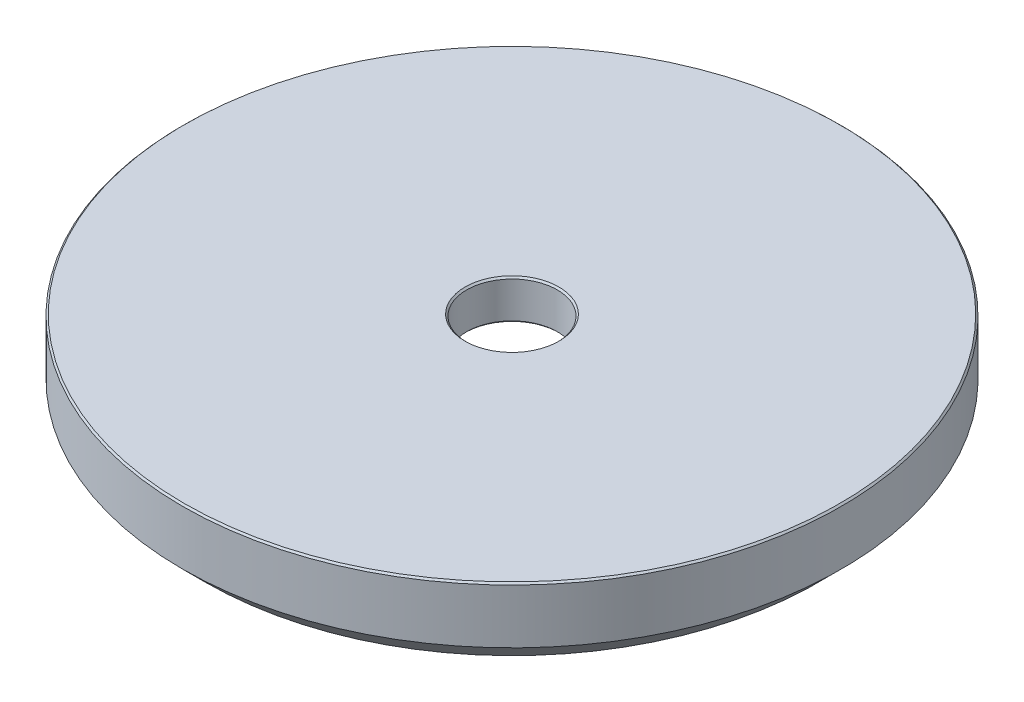
ISO-10303-21;
HEADER;
FILE_DESCRIPTION(('STEP AP214'),'2;1');
FILE_NAME('part.step','',(''),(''),'','','');
FILE_SCHEMA(('AUTOMOTIVE_DESIGN { 1 0 10303 214 1 1 1 1 }'));
ENDSEC;
DATA;
#1=APPLICATION_CONTEXT('core data for automotive mechanical design processes');
#2=APPLICATION_PROTOCOL_DEFINITION('international standard','automotive_design',2000,#1);
#3=PRODUCT_CONTEXT('',#1,'mechanical');
#4=PRODUCT('Part','Part','',(#3));
#5=PRODUCT_RELATED_PRODUCT_CATEGORY('part','',(#4));
#6=PRODUCT_DEFINITION_FORMATION('','',#4);
#7=PRODUCT_DEFINITION_CONTEXT('part definition',#1,'design');
#8=PRODUCT_DEFINITION('design','',#6,#7);
#9=PRODUCT_DEFINITION_SHAPE('','',#8);
#10=(LENGTH_UNIT() NAMED_UNIT(*) SI_UNIT(.MILLI.,.METRE.));
#11=(NAMED_UNIT(*) PLANE_ANGLE_UNIT() SI_UNIT($,.RADIAN.));
#12=(NAMED_UNIT(*) SI_UNIT($,.STERADIAN.) SOLID_ANGLE_UNIT());
#13=UNCERTAINTY_MEASURE_WITH_UNIT(LENGTH_MEASURE(1.E-05),#10,'distance_accuracy_value','');
#14=(GEOMETRIC_REPRESENTATION_CONTEXT(3) GLOBAL_UNCERTAINTY_ASSIGNED_CONTEXT((#13)) GLOBAL_UNIT_ASSIGNED_CONTEXT((#10,
#11,#12)) REPRESENTATION_CONTEXT('',''));
#15=CARTESIAN_POINT('',(0.,0.,0.));
#16=DIRECTION('',(0.,0.,1.));
#17=DIRECTION('',(1.,0.,0.));
#18=AXIS2_PLACEMENT_3D('',#15,#16,#17);
#19=CARTESIAN_POINT('',(0.,25.,0.));
#20=DIRECTION('',(0.,1.,0.));
#21=DIRECTION('',(0.,0.,1.));
#22=AXIS2_PLACEMENT_3D('',#19,#20,#21);
#23=PLANE('',#22);
#24=CARTESIAN_POINT('',(0.,25.,0.));
#25=DIRECTION('',(0.,-1.,0.));
#26=DIRECTION('',(0.,0.,-1.));
#27=AXIS2_PLACEMENT_3D('',#24,#25,#26);
#28=CIRCLE('',#27,134.);
#29=CARTESIAN_POINT('',(0.,25.,-134.));
#30=VERTEX_POINT('',#29);
#31=EDGE_CURVE('E93',#30,#30,#28,.T.);
#32=ORIENTED_EDGE('',*,*,#31,.F.);
#33=EDGE_LOOP('',(#32));
#34=FACE_BOUND('',#33,.T.);
#35=CARTESIAN_POINT('',(0.,25.,0.));
#36=DIRECTION('',(0.,-1.,0.));
#37=DIRECTION('',(0.,0.,-1.));
#38=AXIS2_PLACEMENT_3D('',#35,#36,#37);
#39=CIRCLE('',#38,143.);
#40=CARTESIAN_POINT('',(0.,25.,-143.));
#41=VERTEX_POINT('',#40);
#42=EDGE_CURVE('E90',#41,#41,#39,.T.);
#43=ORIENTED_EDGE('',*,*,#42,.T.);
#44=EDGE_LOOP('',(#43));
#45=FACE_BOUND('',#44,.T.);
#46=ADVANCED_FACE('F39',(#34,#45),#23,.F.);
#47=CARTESIAN_POINT('',(0.,10.,0.));
#48=DIRECTION('',(0.,-1.,0.));
#49=DIRECTION('',(0.,0.,-1.));
#50=AXIS2_PLACEMENT_3D('',#47,#48,#49);
#51=CYLINDRICAL_SURFACE('',#50,143.);
#52=CARTESIAN_POINT('',(0.,20.0000000017948,0.));
#53=DIRECTION('',(0.,1.,0.));
#54=DIRECTION('',(0.,0.,1.));
#55=AXIS2_PLACEMENT_3D('',#52,#53,#54);
#56=CIRCLE('',#55,143.);
#57=CARTESIAN_POINT('',(0.,20.0000000017948,143.));
#58=VERTEX_POINT('',#57);
#59=EDGE_CURVE('E47',#58,#58,#56,.F.);
#60=ORIENTED_EDGE('',*,*,#59,.T.);
#61=EDGE_LOOP('',(#60));
#62=FACE_BOUND('',#61,.T.);
#63=ORIENTED_EDGE('',*,*,#42,.F.);
#64=EDGE_LOOP('',(#63));
#65=FACE_BOUND('',#64,.T.);
#66=ADVANCED_FACE('F124',(#62,#65),#51,.F.);
#67=CARTESIAN_POINT('',(0.,25.,0.));
#68=DIRECTION('',(0.,-1.,0.));
#69=DIRECTION('',(0.,0.,-1.));
#70=AXIS2_PLACEMENT_3D('',#67,#68,#69);
#71=CYLINDRICAL_SURFACE('',#70,134.);
#72=ORIENTED_EDGE('',*,*,#31,.T.);
#73=EDGE_LOOP('',(#72));
#74=FACE_BOUND('',#73,.T.);
#75=CARTESIAN_POINT('',(0.,15.,0.));
#76=DIRECTION('',(0.,-1.,0.));
#77=DIRECTION('',(0.,0.,-1.));
#78=AXIS2_PLACEMENT_3D('',#75,#76,#77);
#79=CIRCLE('',#78,134.);
#80=CARTESIAN_POINT('',(0.,15.,-134.));
#81=VERTEX_POINT('',#80);
#82=EDGE_CURVE('E96',#81,#81,#79,.T.);
#83=ORIENTED_EDGE('',*,*,#82,.F.);
#84=EDGE_LOOP('',(#83));
#85=FACE_BOUND('',#84,.T.);
#86=ADVANCED_FACE('F130',(#74,#85),#71,.T.);
#87=CARTESIAN_POINT('',(0.,15.,0.));
#88=DIRECTION('',(0.,-1.,0.));
#89=DIRECTION('',(0.,0.,-1.));
#90=AXIS2_PLACEMENT_3D('',#87,#88,#89);
#91=PLANE('',#90);
#92=CARTESIAN_POINT('',(0.,15.,0.));
#93=DIRECTION('',(0.,-1.,0.));
#94=DIRECTION('',(0.,0.,-1.));
#95=AXIS2_PLACEMENT_3D('',#92,#93,#94);
#96=CIRCLE('',#95,63.4999999991027);
#97=CARTESIAN_POINT('',(0.,15.,-63.4999999991027));
#98=VERTEX_POINT('',#97);
#99=EDGE_CURVE('E66',#98,#98,#96,.F.);
#100=ORIENTED_EDGE('',*,*,#99,.T.);
#101=EDGE_LOOP('',(#100));
#102=FACE_BOUND('',#101,.T.);
#103=ORIENTED_EDGE('',*,*,#82,.T.);
#104=EDGE_LOOP('',(#103));
#105=FACE_BOUND('',#104,.T.);
#106=ADVANCED_FACE('F199',(#102,#105),#91,.T.);
#107=CARTESIAN_POINT('',(0.,18.,0.));
#108=DIRECTION('',(0.,-1.,0.));
#109=DIRECTION('',(0.,0.,-1.));
#110=AXIS2_PLACEMENT_3D('',#107,#108,#109);
#111=CYLINDRICAL_SURFACE('',#110,150.);
#112=CARTESIAN_POINT('',(0.,13.0000000026923,0.));
#113=DIRECTION('',(0.,-1.,0.));
#114=DIRECTION('',(0.,0.,-1.));
#115=AXIS2_PLACEMENT_3D('',#112,#113,#114);
#116=CIRCLE('',#115,150.);
#117=CARTESIAN_POINT('',(0.,13.0000000026923,-150.));
#118=VERTEX_POINT('',#117);
#119=EDGE_CURVE('E63',#118,#118,#116,.T.);
#120=ORIENTED_EDGE('',*,*,#119,.T.);
#121=EDGE_LOOP('',(#120));
#122=FACE_BOUND('',#121,.T.);
#123=CARTESIAN_POINT('',(0.,18.,0.));
#124=DIRECTION('',(0.,-1.,0.));
#125=DIRECTION('',(0.,0.,-1.));
#126=AXIS2_PLACEMENT_3D('',#123,#124,#125);
#127=CIRCLE('',#126,150.);
#128=CARTESIAN_POINT('',(0.,18.,-150.));
#129=VERTEX_POINT('',#128);
#130=EDGE_CURVE('E99',#129,#129,#127,.T.);
#131=ORIENTED_EDGE('',*,*,#130,.F.);
#132=EDGE_LOOP('',(#131));
#133=FACE_BOUND('',#132,.T.);
#134=ADVANCED_FACE('F196',(#122,#133),#111,.F.);
#135=CARTESIAN_POINT('',(150.,18.,0.));
#136=DIRECTION('',(0.,1.,0.));
#137=DIRECTION('',(0.,0.,1.));
#138=AXIS2_PLACEMENT_3D('',#135,#136,#137);
#139=PLANE('',#138);
#140=CARTESIAN_POINT('',(0.,18.,0.));
#141=DIRECTION('',(0.,1.,0.));
#142=DIRECTION('',(0.,0.,1.));
#143=AXIS2_PLACEMENT_3D('',#140,#141,#142);
#144=CIRCLE('',#143,144.999999998205);
#145=CARTESIAN_POINT('',(0.,18.,144.999999998205));
#146=VERTEX_POINT('',#145);
#147=EDGE_CURVE('E10',#146,#146,#144,.T.);
#148=ORIENTED_EDGE('',*,*,#147,.T.);
#149=EDGE_LOOP('',(#148));
#150=FACE_BOUND('',#149,.T.);
#151=ORIENTED_EDGE('',*,*,#130,.T.);
#152=EDGE_LOOP('',(#151));
#153=FACE_BOUND('',#152,.T.);
#154=ADVANCED_FACE('F144',(#150,#153),#139,.F.);
#155=CARTESIAN_POINT('',(200.,58.,0.));
#156=DIRECTION('',(0.,1.,0.));
#157=DIRECTION('',(0.,0.,1.));
#158=AXIS2_PLACEMENT_3D('',#155,#156,#157);
#159=PLANE('',#158);
#160=CARTESIAN_POINT('',(0.,58.,0.));
#161=DIRECTION('',(0.,1.,0.));
#162=DIRECTION('',(0.,0.,1.));
#163=AXIS2_PLACEMENT_3D('',#160,#161,#162);
#164=CIRCLE('',#163,199.000000000897);
#165=CARTESIAN_POINT('',(0.,58.,199.000000000897));
#166=VERTEX_POINT('',#165);
#167=EDGE_CURVE('E81',#166,#166,#164,.T.);
#168=ORIENTED_EDGE('',*,*,#167,.T.);
#169=EDGE_LOOP('',(#168));
#170=FACE_BOUND('',#169,.T.);
#171=CARTESIAN_POINT('',(0.,58.,0.));
#172=DIRECTION('',(0.,1.,0.));
#173=DIRECTION('',(0.,0.,1.));
#174=AXIS2_PLACEMENT_3D('',#171,#172,#173);
#175=CIRCLE('',#174,28.5000000008976);
#176=CARTESIAN_POINT('',(0.,58.,28.5000000008976));
#177=VERTEX_POINT('',#176);
#178=EDGE_CURVE('E84',#177,#177,#175,.F.);
#179=ORIENTED_EDGE('',*,*,#178,.T.);
#180=EDGE_LOOP('',(#179));
#181=FACE_BOUND('',#180,.T.);
#182=ADVANCED_FACE('F141',(#170,#181),#159,.T.);
#183=CARTESIAN_POINT('',(0.,58.,0.));
#184=DIRECTION('',(0.,-1.,0.));
#185=DIRECTION('',(0.,0.,-1.));
#186=AXIS2_PLACEMENT_3D('',#183,#184,#185);
#187=CYLINDRICAL_SURFACE('',#186,200.);
#188=CARTESIAN_POINT('',(0.,23.999999987436,0.));
#189=DIRECTION('',(0.,-1.,0.));
#190=DIRECTION('',(0.,0.,-1.));
#191=AXIS2_PLACEMENT_3D('',#188,#189,#190);
#192=CIRCLE('',#191,200.);
#193=CARTESIAN_POINT('',(0.,23.999999987436,200.));
#194=VERTEX_POINT('',#193);
#195=EDGE_CURVE('E51',#194,#194,#192,.F.);
#196=ORIENTED_EDGE('',*,*,#195,.T.);
#197=EDGE_LOOP('',(#196));
#198=FACE_BOUND('',#197,.T.);
#199=CARTESIAN_POINT('',(0.,56.9999999991024,0.));
#200=DIRECTION('',(0.,1.,0.));
#201=DIRECTION('',(0.,0.,1.));
#202=AXIS2_PLACEMENT_3D('',#199,#200,#201);
#203=CIRCLE('',#202,200.);
#204=CARTESIAN_POINT('',(0.,56.9999999991024,200.));
#205=VERTEX_POINT('',#204);
#206=EDGE_CURVE('E87',#205,#205,#203,.F.);
#207=ORIENTED_EDGE('',*,*,#206,.T.);
#208=EDGE_LOOP('',(#207));
#209=FACE_BOUND('',#208,.T.);
#210=ADVANCED_FACE('F139',(#198,#209),#187,.T.);
#211=CARTESIAN_POINT('',(0.,10.,0.));
#212=DIRECTION('',(0.,-1.,0.));
#213=DIRECTION('',(0.,0.,-1.));
#214=AXIS2_PLACEMENT_3D('',#211,#212,#213);
#215=PLANE('',#214);
#216=CARTESIAN_POINT('',(0.,10.,0.));
#217=DIRECTION('',(0.,-1.,0.));
#218=DIRECTION('',(0.,0.,-1.));
#219=AXIS2_PLACEMENT_3D('',#216,#217,#218);
#220=CIRCLE('',#219,185.999999987436);
#221=CARTESIAN_POINT('',(0.,10.,185.999999987436));
#222=VERTEX_POINT('',#221);
#223=EDGE_CURVE('E55',#222,#222,#220,.T.);
#224=ORIENTED_EDGE('',*,*,#223,.T.);
#225=EDGE_LOOP('',(#224));
#226=FACE_BOUND('',#225,.T.);
#227=CARTESIAN_POINT('',(0.,10.,0.));
#228=DIRECTION('',(0.,-1.,0.));
#229=DIRECTION('',(0.,0.,-1.));
#230=AXIS2_PLACEMENT_3D('',#227,#228,#229);
#231=CIRCLE('',#230,152.999999997308);
#232=CARTESIAN_POINT('',(0.,10.,-152.999999997308));
#233=VERTEX_POINT('',#232);
#234=EDGE_CURVE('E60',#233,#233,#231,.F.);
#235=ORIENTED_EDGE('',*,*,#234,.T.);
#236=EDGE_LOOP('',(#235));
#237=FACE_BOUND('',#236,.T.);
#238=ADVANCED_FACE('F136',(#226,#237),#215,.T.);
#239=CARTESIAN_POINT('',(0.,15.,0.));
#240=DIRECTION('',(0.,-1.,0.));
#241=DIRECTION('',(0.,0.,-1.));
#242=AXIS2_PLACEMENT_3D('',#239,#240,#241);
#243=CYLINDRICAL_SURFACE('',#242,27.5);
#244=CARTESIAN_POINT('',(0.,57.0000000008972,0.));
#245=DIRECTION('',(0.,1.,0.));
#246=DIRECTION('',(0.,0.,1.));
#247=AXIS2_PLACEMENT_3D('',#244,#245,#246);
#248=CIRCLE('',#247,27.5);
#249=CARTESIAN_POINT('',(0.,57.0000000008972,27.5));
#250=VERTEX_POINT('',#249);
#251=EDGE_CURVE('E75',#250,#250,#248,.T.);
#252=ORIENTED_EDGE('',*,*,#251,.T.);
#253=EDGE_LOOP('',(#252));
#254=FACE_BOUND('',#253,.T.);
#255=CARTESIAN_POINT('',(0.,35.0000000008976,0.));
#256=DIRECTION('',(0.,1.,0.));
#257=DIRECTION('',(0.,0.,1.));
#258=AXIS2_PLACEMENT_3D('',#255,#256,#257);
#259=CIRCLE('',#258,27.5);
#260=CARTESIAN_POINT('',(0.,35.0000000008976,27.5));
#261=VERTEX_POINT('',#260);
#262=EDGE_CURVE('E78',#261,#261,#259,.F.);
#263=ORIENTED_EDGE('',*,*,#262,.T.);
#264=EDGE_LOOP('',(#263));
#265=FACE_BOUND('',#264,.T.);
#266=ADVANCED_FACE('F120',(#254,#265),#243,.F.);
#267=CARTESIAN_POINT('',(27.5,34.,0.));
#268=DIRECTION('',(0.,1.,0.));
#269=DIRECTION('',(0.,0.,1.));
#270=AXIS2_PLACEMENT_3D('',#267,#268,#269);
#271=PLANE('',#270);
#272=CARTESIAN_POINT('',(0.,34.,0.));
#273=DIRECTION('',(0.,1.,0.));
#274=DIRECTION('',(0.,0.,1.));
#275=AXIS2_PLACEMENT_3D('',#272,#273,#274);
#276=CIRCLE('',#275,28.4999999991027);
#277=CARTESIAN_POINT('',(0.,34.,28.4999999991027));
#278=VERTEX_POINT('',#277);
#279=EDGE_CURVE('E72',#278,#278,#276,.T.);
#280=ORIENTED_EDGE('',*,*,#279,.T.);
#281=EDGE_LOOP('',(#280));
#282=FACE_BOUND('',#281,.T.);
#283=CARTESIAN_POINT('',(0.,34.,0.));
#284=DIRECTION('',(0.,-1.,0.));
#285=DIRECTION('',(0.,0.,-1.));
#286=AXIS2_PLACEMENT_3D('',#283,#284,#285);
#287=CIRCLE('',#286,62.5);
#288=CARTESIAN_POINT('',(0.,34.,-62.5));
#289=VERTEX_POINT('',#288);
#290=EDGE_CURVE('E102',#289,#289,#287,.T.);
#291=ORIENTED_EDGE('',*,*,#290,.T.);
#292=EDGE_LOOP('',(#291));
#293=FACE_BOUND('',#292,.T.);
#294=ADVANCED_FACE('F106',(#282,#293),#271,.F.);
#295=CARTESIAN_POINT('',(0.,15.,0.));
#296=DIRECTION('',(0.,-1.,0.));
#297=DIRECTION('',(0.,0.,-1.));
#298=AXIS2_PLACEMENT_3D('',#295,#296,#297);
#299=CYLINDRICAL_SURFACE('',#298,62.5);
#300=CARTESIAN_POINT('',(0.,16.0000000008976,0.));
#301=DIRECTION('',(0.,-1.,0.));
#302=DIRECTION('',(0.,0.,-1.));
#303=AXIS2_PLACEMENT_3D('',#300,#301,#302);
#304=CIRCLE('',#303,62.5);
#305=CARTESIAN_POINT('',(0.,16.0000000008976,-62.5));
#306=VERTEX_POINT('',#305);
#307=EDGE_CURVE('E69',#306,#306,#304,.T.);
#308=ORIENTED_EDGE('',*,*,#307,.T.);
#309=EDGE_LOOP('',(#308));
#310=FACE_BOUND('',#309,.T.);
#311=ORIENTED_EDGE('',*,*,#290,.F.);
#312=EDGE_LOOP('',(#311));
#313=FACE_BOUND('',#312,.T.);
#314=ADVANCED_FACE('F108',(#310,#313),#299,.F.);
#315=CARTESIAN_POINT('',(0.,56.9999999991024,0.));
#316=DIRECTION('',(0.,-1.,0.));
#317=DIRECTION('',(0.,0.,-1.));
#318=AXIS2_PLACEMENT_3D('',#315,#316,#317);
#319=CONICAL_SURFACE('',#318,200.,0.785398162500027);
#320=ORIENTED_EDGE('',*,*,#167,.F.);
#321=EDGE_LOOP('',(#320));
#322=FACE_BOUND('',#321,.T.);
#323=ORIENTED_EDGE('',*,*,#206,.F.);
#324=EDGE_LOOP('',(#323));
#325=FACE_BOUND('',#324,.T.);
#326=ADVANCED_FACE('F110',(#322,#325),#319,.T.);
#327=CARTESIAN_POINT('',(0.,58.,0.));
#328=DIRECTION('',(0.,1.,0.));
#329=DIRECTION('',(0.,0.,1.));
#330=AXIS2_PLACEMENT_3D('',#327,#328,#329);
#331=CONICAL_SURFACE('',#330,28.5000000008976,0.785398164294869);
#332=ORIENTED_EDGE('',*,*,#251,.F.);
#333=EDGE_LOOP('',(#332));
#334=FACE_BOUND('',#333,.T.);
#335=ORIENTED_EDGE('',*,*,#178,.F.);
#336=EDGE_LOOP('',(#335));
#337=FACE_BOUND('',#336,.T.);
#338=ADVANCED_FACE('F117',(#334,#337),#331,.F.);
#339=CARTESIAN_POINT('',(0.,35.0000000008976,0.));
#340=DIRECTION('',(0.,-1.,0.));
#341=DIRECTION('',(0.,0.,-1.));
#342=AXIS2_PLACEMENT_3D('',#339,#340,#341);
#343=CONICAL_SURFACE('',#342,27.5,0.785398162500013);
#344=ORIENTED_EDGE('',*,*,#279,.F.);
#345=EDGE_LOOP('',(#344));
#346=FACE_BOUND('',#345,.T.);
#347=ORIENTED_EDGE('',*,*,#262,.F.);
#348=EDGE_LOOP('',(#347));
#349=FACE_BOUND('',#348,.T.);
#350=ADVANCED_FACE('F158',(#346,#349),#343,.F.);
#351=CARTESIAN_POINT('',(0.,16.0000000008976,0.));
#352=DIRECTION('',(0.,-1.,0.));
#353=DIRECTION('',(0.,0.,-1.));
#354=AXIS2_PLACEMENT_3D('',#351,#352,#353);
#355=CONICAL_SURFACE('',#354,62.5,0.785398162500013);
#356=ORIENTED_EDGE('',*,*,#99,.F.);
#357=EDGE_LOOP('',(#356));
#358=FACE_BOUND('',#357,.T.);
#359=ORIENTED_EDGE('',*,*,#307,.F.);
#360=EDGE_LOOP('',(#359));
#361=FACE_BOUND('',#360,.T.);
#362=ADVANCED_FACE('F165',(#358,#361),#355,.F.);
#363=CARTESIAN_POINT('',(0.,13.0000000026923,0.));
#364=DIRECTION('',(0.,-1.,0.));
#365=DIRECTION('',(0.,0.,-1.));
#366=AXIS2_PLACEMENT_3D('',#363,#364,#365);
#367=CONICAL_SURFACE('',#366,150.,0.785398162500009);
#368=ORIENTED_EDGE('',*,*,#234,.F.);
#369=EDGE_LOOP('',(#368));
#370=FACE_BOUND('',#369,.T.);
#371=ORIENTED_EDGE('',*,*,#119,.F.);
#372=EDGE_LOOP('',(#371));
#373=FACE_BOUND('',#372,.T.);
#374=ADVANCED_FACE('F172',(#370,#373),#367,.F.);
#375=CARTESIAN_POINT('',(0.,10.,0.));
#376=DIRECTION('',(0.,1.,0.));
#377=DIRECTION('',(0.,0.,1.));
#378=AXIS2_PLACEMENT_3D('',#375,#376,#377);
#379=CONICAL_SURFACE('',#378,185.999999987436,0.785398164294888);
#380=CARTESIAN_POINT('',(0.,23.999999987436,200.));
#381=CARTESIAN_POINT('',(0.,23.8541666542336,199.854166666536));
#382=CARTESIAN_POINT('',(0.,23.7083333210311,199.708333333072));
#383=CARTESIAN_POINT('',(0.,23.4166666546262,199.416666666143));
#384=CARTESIAN_POINT('',(0.,23.2708333214237,199.270833332679));
#385=CARTESIAN_POINT('',(0.,22.9791666550188,198.979166665751));
#386=CARTESIAN_POINT('',(0.,22.8333333218164,198.833333332286));
#387=CARTESIAN_POINT('',(0.,22.5416666554115,198.541666665358));
#388=CARTESIAN_POINT('',(0.,22.395833322209,198.395833331894));
#389=CARTESIAN_POINT('',(0.,22.1041666558041,198.104166664965));
#390=CARTESIAN_POINT('',(0.,21.9583333226016,197.958333331501));
#391=CARTESIAN_POINT('',(0.,21.6666666561967,197.666666664573));
#392=CARTESIAN_POINT('',(0.,21.5208333229942,197.520833331108));
#393=CARTESIAN_POINT('',(0.,21.2291666565893,197.22916666418));
#394=CARTESIAN_POINT('',(0.,21.0833333233869,197.083333330716));
#395=CARTESIAN_POINT('',(0.,20.7916666569819,196.791666663787));
#396=CARTESIAN_POINT('',(0.,20.6458333237795,196.645833330323));
#397=CARTESIAN_POINT('',(0.,20.3541666573746,196.354166663395));
#398=CARTESIAN_POINT('',(0.,20.2083333241721,196.208333329931));
#399=CARTESIAN_POINT('',(0.,19.9166666577672,195.916666663002));
#400=CARTESIAN_POINT('',(0.,19.7708333245647,195.770833329538));
#401=CARTESIAN_POINT('',(0.,19.4791666581598,195.479166662609));
#402=CARTESIAN_POINT('',(0.,19.3333333249574,195.333333329145));
#403=CARTESIAN_POINT('',(0.,19.0416666585524,195.041666662217));
#404=CARTESIAN_POINT('',(0.,18.89583332535,194.895833328753));
#405=CARTESIAN_POINT('',(0.,18.6041666589451,194.604166661824));
#406=CARTESIAN_POINT('',(0.,18.4583333257426,194.45833332836));
#407=CARTESIAN_POINT('',(0.,18.1666666593377,194.166666661432));
#408=CARTESIAN_POINT('',(0.,18.0208333261352,194.020833327967));
#409=CARTESIAN_POINT('',(0.,17.7291666597303,193.729166661039));
#410=CARTESIAN_POINT('',(0.,17.5833333265279,193.583333327575));
#411=CARTESIAN_POINT('',(0.,17.2916666601229,193.291666660646));
#412=CARTESIAN_POINT('',(0.,17.1458333269205,193.145833327182));
#413=CARTESIAN_POINT('',(0.,16.8541666605156,192.854166660254));
#414=CARTESIAN_POINT('',(0.,16.7083333273131,192.708333326789));
#415=CARTESIAN_POINT('',(0.,16.4166666609082,192.416666659861));
#416=CARTESIAN_POINT('',(0.,16.2708333277057,192.270833326397));
#417=CARTESIAN_POINT('',(0.,15.9791666613008,191.979166659468));
#418=CARTESIAN_POINT('',(0.,15.8333333280984,191.833333326004));
#419=CARTESIAN_POINT('',(0.,15.5416666616934,191.541666659076));
#420=CARTESIAN_POINT('',(0.,15.395833328491,191.395833325612));
#421=CARTESIAN_POINT('',(0.,15.1041666620861,191.104166658683));
#422=CARTESIAN_POINT('',(0.,14.9583333288836,190.958333325219));
#423=CARTESIAN_POINT('',(0.,14.6666666624787,190.66666665829));
#424=CARTESIAN_POINT('',(0.,14.5208333292762,190.520833324826));
#425=CARTESIAN_POINT('',(0.,14.2291666628713,190.229166657898));
#426=CARTESIAN_POINT('',(0.,14.0833333296688,190.083333324434));
#427=CARTESIAN_POINT('',(0.,13.7916666632639,189.791666657505));
#428=CARTESIAN_POINT('',(0.,13.6458333300615,189.645833324041));
#429=CARTESIAN_POINT('',(0.,13.3541666636566,189.354166657113));
#430=CARTESIAN_POINT('',(0.,13.2083333304541,189.208333323648));
#431=CARTESIAN_POINT('',(0.,12.9166666640492,188.91666665672));
#432=CARTESIAN_POINT('',(0.,12.7708333308467,188.770833323256));
#433=CARTESIAN_POINT('',(0.,12.4791666644418,188.479166656327));
#434=CARTESIAN_POINT('',(0.,12.3333333312393,188.333333322863));
#435=CARTESIAN_POINT('',(0.,12.0416666648344,188.041666655935));
#436=CARTESIAN_POINT('',(0.,11.895833331632,187.89583332247));
#437=CARTESIAN_POINT('',(0.,11.604166665227,187.604166655542));
#438=CARTESIAN_POINT('',(0.,11.4583333320246,187.458333322078));
#439=CARTESIAN_POINT('',(0.,11.1666666656197,187.166666655149));
#440=CARTESIAN_POINT('',(0.,11.0208333324172,187.020833321685));
#441=CARTESIAN_POINT('',(0.,10.7291666660123,186.729166654757));
#442=CARTESIAN_POINT('',(0.,10.5833333328098,186.583333321293));
#443=CARTESIAN_POINT('',(0.,10.2916666664049,186.291666654364));
#444=CARTESIAN_POINT('',(0.,10.1458333332025,186.1458333209));
#445=CARTESIAN_POINT('',(0.,10.,185.999999987436));
#446=B_SPLINE_CURVE_WITH_KNOTS('',3,(#380,#381,#382,#383,#384,#385,#386,#387,#388,#389,#390,
#391,#392,#393,#394,#395,#396,#397,#398,#399,#400,#401,#402,#403,#404,#405,#406,#407,#408,#409,
#410,#411,#412,#413,#414,#415,#416,#417,#418,#419,#420,#421,#422,#423,#424,#425,#426,#427,#428,
#429,#430,#431,#432,#433,#434,#435,#436,#437,#438,#439,#440,#441,#442,#443,#444,#445),
.UNSPECIFIED.,.F.,.F.,(4,2,2,2,2,2,2,2,2,2,2,2,2,2,2,2,2,2,2,2,2,2,2,2,2,2,2,2,2,2,2,2,4),(0.,
0.61871843353824,1.23743686707648,1.85615530061472,2.47487373415295,3.09359216769119,
3.71231060122943,4.33102903476765,4.94974746830589,5.56846590184413,6.18718433538237,
6.80590276892061,7.42462120245885,8.04333963599708,8.66205806953532,9.28077650307356,
9.8994949366118,10.51821337015,11.1369318036883,11.7556502372265,12.3743686707648,
12.993087104303,13.6118055378412,14.2305239713795,14.8492424049177,15.4679608384559,
16.0866792719942,16.7053977055324,17.3241161390706,17.9428345726089,18.5615530061471,
19.1802714396854,19.7989898732236),.UNSPECIFIED.);
#447=EDGE_CURVE('BSEAM178',#194,#222,#446,.T.);
#448=ORIENTED_EDGE('',*,*,#195,.F.);
#449=ORIENTED_EDGE('',*,*,#223,.F.);
#450=ORIENTED_EDGE('',*,*,#447,.T.);
#451=ORIENTED_EDGE('',*,*,#447,.F.);
#452=EDGE_LOOP('',(#448,#450,#449,#451));
#453=FACE_BOUND('',#452,.T.);
#454=ADVANCED_FACE('F178',(#453),#379,.T.);
#455=CARTESIAN_POINT('',(0.,20.0000000017948,0.));
#456=DIRECTION('',(0.,-1.,0.));
#457=DIRECTION('',(0.,0.,-1.));
#458=AXIS2_PLACEMENT_3D('',#455,#456,#457);
#459=CONICAL_SURFACE('',#458,143.,0.785398162500006);
#460=ORIENTED_EDGE('',*,*,#147,.F.);
#461=EDGE_LOOP('',(#460));
#462=FACE_BOUND('',#461,.T.);
#463=ORIENTED_EDGE('',*,*,#59,.F.);
#464=EDGE_LOOP('',(#463));
#465=FACE_BOUND('',#464,.T.);
#466=ADVANCED_FACE('F42',(#462,#465),#459,.F.);
#467=CLOSED_SHELL('',(#46,#66,#86,#106,#134,#154,#182,#210,#238,#266,#294,#314,#326,#338,#350,
#362,#374,#454,#466));
#468=MANIFOLD_SOLID_BREP('B2',#467);
#469=ADVANCED_BREP_SHAPE_REPRESENTATION('',(#18,#468),#14);
#470=SHAPE_DEFINITION_REPRESENTATION(#9,#469);
ENDSEC;
END-ISO-10303-21;
